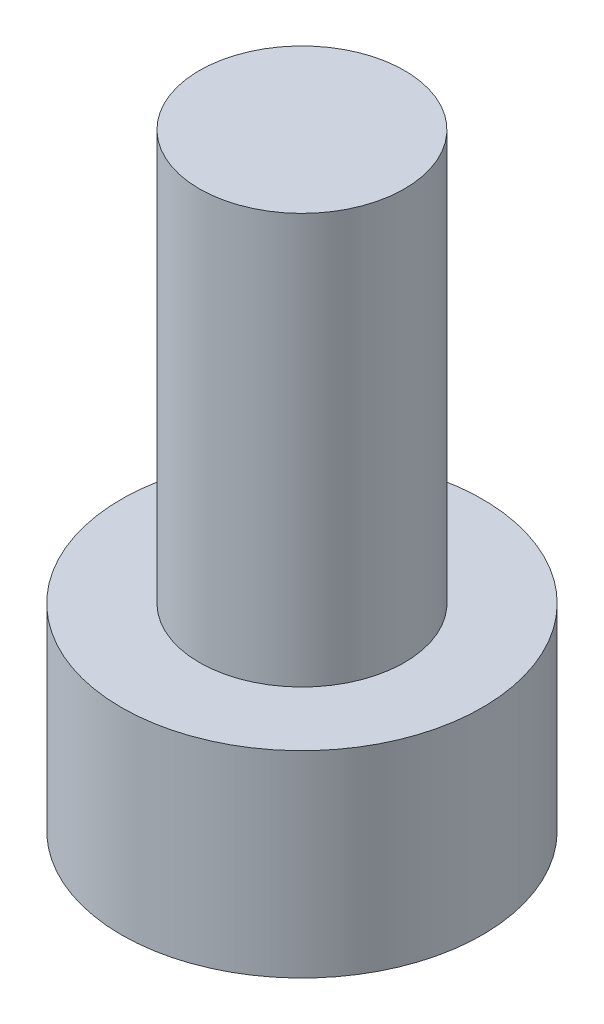
ISO-10303-21;
HEADER;
FILE_DESCRIPTION(('STEP AP214'),'2;1');
FILE_NAME('part.step','',(''),(''),'','','');
FILE_SCHEMA(('AUTOMOTIVE_DESIGN { 1 0 10303 214 1 1 1 1 }'));
ENDSEC;
DATA;
#1=APPLICATION_CONTEXT('core data for automotive mechanical design processes');
#2=APPLICATION_PROTOCOL_DEFINITION('international standard','automotive_design',2000,#1);
#3=PRODUCT_CONTEXT('',#1,'mechanical');
#4=PRODUCT('Part','Part','',(#3));
#5=PRODUCT_RELATED_PRODUCT_CATEGORY('part','',(#4));
#6=PRODUCT_DEFINITION_FORMATION('','',#4);
#7=PRODUCT_DEFINITION_CONTEXT('part definition',#1,'design');
#8=PRODUCT_DEFINITION('design','',#6,#7);
#9=PRODUCT_DEFINITION_SHAPE('','',#8);
#10=(LENGTH_UNIT() NAMED_UNIT(*) SI_UNIT(.MILLI.,.METRE.));
#11=(NAMED_UNIT(*) PLANE_ANGLE_UNIT() SI_UNIT($,.RADIAN.));
#12=(NAMED_UNIT(*) SI_UNIT($,.STERADIAN.) SOLID_ANGLE_UNIT());
#13=UNCERTAINTY_MEASURE_WITH_UNIT(LENGTH_MEASURE(1.E-05),#10,'distance_accuracy_value','');
#14=(GEOMETRIC_REPRESENTATION_CONTEXT(3) GLOBAL_UNCERTAINTY_ASSIGNED_CONTEXT((#13)) GLOBAL_UNIT_ASSIGNED_CONTEXT((#10,
#11,#12)) REPRESENTATION_CONTEXT('',''));
#15=CARTESIAN_POINT('',(0.,0.,0.));
#16=DIRECTION('',(0.,0.,1.));
#17=DIRECTION('',(1.,0.,0.));
#18=AXIS2_PLACEMENT_3D('',#15,#16,#17);
#19=CARTESIAN_POINT('',(0.,2.4,0.));
#20=DIRECTION('',(0.,-1.,0.));
#21=DIRECTION('',(0.,0.,-1.));
#22=AXIS2_PLACEMENT_3D('',#19,#20,#21);
#23=CYLINDRICAL_SURFACE('',#22,2.2);
#24=CARTESIAN_POINT('',(0.,2.4,0.));
#25=DIRECTION('',(0.,1.,0.));
#26=DIRECTION('',(0.,0.,1.));
#27=AXIS2_PLACEMENT_3D('',#24,#25,#26);
#28=CIRCLE('',#27,2.2);
#29=CARTESIAN_POINT('',(0.,2.4,2.2));
#30=VERTEX_POINT('',#29);
#31=EDGE_CURVE('E46',#30,#30,#28,.T.);
#32=ORIENTED_EDGE('',*,*,#31,.F.);
#33=EDGE_LOOP('',(#32));
#34=FACE_BOUND('',#33,.T.);
#35=CARTESIAN_POINT('',(0.,0.,0.));
#36=DIRECTION('',(0.,1.,0.));
#37=DIRECTION('',(0.,0.,1.));
#38=AXIS2_PLACEMENT_3D('',#35,#36,#37);
#39=CIRCLE('',#38,2.2);
#40=CARTESIAN_POINT('',(0.,0.,2.2));
#41=VERTEX_POINT('',#40);
#42=EDGE_CURVE('E41',#41,#41,#39,.T.);
#43=ORIENTED_EDGE('',*,*,#42,.T.);
#44=EDGE_LOOP('',(#43));
#45=FACE_BOUND('',#44,.T.);
#46=ADVANCED_FACE('F38',(#34,#45),#23,.T.);
#47=CARTESIAN_POINT('',(0.,2.4,0.));
#48=DIRECTION('',(0.,1.,0.));
#49=DIRECTION('',(0.,0.,1.));
#50=AXIS2_PLACEMENT_3D('',#47,#48,#49);
#51=PLANE('',#50);
#52=CARTESIAN_POINT('',(0.,2.4,0.));
#53=DIRECTION('',(0.,1.,0.));
#54=DIRECTION('',(0.,0.,1.));
#55=AXIS2_PLACEMENT_3D('',#52,#53,#54);
#56=CIRCLE('',#55,1.25);
#57=CARTESIAN_POINT('',(0.,2.4,1.25));
#58=VERTEX_POINT('',#57);
#59=EDGE_CURVE('E11',#58,#58,#56,.T.);
#60=ORIENTED_EDGE('',*,*,#59,.F.);
#61=EDGE_LOOP('',(#60));
#62=FACE_BOUND('',#61,.T.);
#63=ORIENTED_EDGE('',*,*,#31,.T.);
#64=EDGE_LOOP('',(#63));
#65=FACE_BOUND('',#64,.T.);
#66=ADVANCED_FACE('F158',(#62,#65),#51,.T.);
#67=CARTESIAN_POINT('',(0.,0.,0.));
#68=DIRECTION('',(0.,1.,0.));
#69=DIRECTION('',(0.,0.,1.));
#70=AXIS2_PLACEMENT_3D('',#67,#68,#69);
#71=PLANE('',#70);
#72=DIRECTION('',(-0.999999581919241,0.,-0.000914418581484688));
#73=VECTOR('',#72,1.);
#74=CARTESIAN_POINT('',(0.576435609229103,0.,1.00052752173341));
#75=LINE('',#74,#73);
#76=CARTESIAN_POINT('',(0.576435609229103,0.,1.00052752173341));
#77=VERTEX_POINT('',#76);
#78=CARTESIAN_POINT('',(-0.578264446392072,0.,0.999471642105069));
#79=VERTEX_POINT('',#78);
#80=EDGE_CURVE('E128',#77,#79,#75,.T.);
#81=ORIENTED_EDGE('',*,*,#80,.F.);
#82=DIRECTION('',(-0.500791700680879,0.,0.865567832425139));
#83=VECTOR('',#82,1.);
#84=CARTESIAN_POINT('',(1.15470005562118,0.,0.00105587962834426));
#85=LINE('',#84,#83);
#86=CARTESIAN_POINT('',(1.15470005562118,0.,0.00105587962834426));
#87=VERTEX_POINT('',#86);
#88=EDGE_CURVE('E54',#87,#77,#85,.T.);
#89=ORIENTED_EDGE('',*,*,#88,.F.);
#90=DIRECTION('',(0.499207881238363,0.,0.866482251006623));
#91=VECTOR('',#90,1.);
#92=CARTESIAN_POINT('',(0.578264446392072,0.,-0.99947164210507));
#93=LINE('',#92,#91);
#94=CARTESIAN_POINT('',(0.578264446392072,0.,-0.99947164210507));
#95=VERTEX_POINT('',#94);
#96=EDGE_CURVE('E137',#95,#87,#93,.T.);
#97=ORIENTED_EDGE('',*,*,#96,.F.);
#98=DIRECTION('',(0.999999581919241,0.,0.000914418581484501));
#99=VECTOR('',#98,1.);
#100=CARTESIAN_POINT('',(-0.576435609229103,0.,-1.00052752173341));
#101=LINE('',#100,#99);
#102=CARTESIAN_POINT('',(-0.576435609229103,0.,-1.00052752173341));
#103=VERTEX_POINT('',#102);
#104=EDGE_CURVE('E135',#103,#95,#101,.T.);
#105=ORIENTED_EDGE('',*,*,#104,.F.);
#106=DIRECTION('',(0.500791700680879,0.,-0.865567832425139));
#107=VECTOR('',#106,1.);
#108=CARTESIAN_POINT('',(-1.15470005562117,0.,-0.00105587962834411));
#109=LINE('',#108,#107);
#110=CARTESIAN_POINT('',(-1.15470005562117,0.,-0.00105587962834411));
#111=VERTEX_POINT('',#110);
#112=EDGE_CURVE('E102',#111,#103,#109,.T.);
#113=ORIENTED_EDGE('',*,*,#112,.F.);
#114=DIRECTION('',(-0.499207881238363,0.,-0.866482251006623));
#115=VECTOR('',#114,1.);
#116=CARTESIAN_POINT('',(-0.578264446392072,0.,0.999471642105069));
#117=LINE('',#116,#115);
#118=EDGE_CURVE('E131',#79,#111,#117,.T.);
#119=ORIENTED_EDGE('',*,*,#118,.F.);
#120=EDGE_LOOP('',(#81,#89,#97,#105,#113,#119));
#121=FACE_BOUND('',#120,.T.);
#122=ORIENTED_EDGE('',*,*,#42,.F.);
#123=EDGE_LOOP('',(#122));
#124=FACE_BOUND('',#123,.T.);
#125=ADVANCED_FACE('F155',(#121,#124),#71,.F.);
#126=CARTESIAN_POINT('',(0.,7.4,0.));
#127=DIRECTION('',(0.,-1.,0.));
#128=DIRECTION('',(0.,0.,-1.));
#129=AXIS2_PLACEMENT_3D('',#126,#127,#128);
#130=CYLINDRICAL_SURFACE('',#129,1.25);
#131=CARTESIAN_POINT('',(0.,7.4,0.));
#132=DIRECTION('',(0.,1.,0.));
#133=DIRECTION('',(0.,0.,1.));
#134=AXIS2_PLACEMENT_3D('',#131,#132,#133);
#135=CIRCLE('',#134,1.25);
#136=CARTESIAN_POINT('',(0.,7.4,1.25));
#137=VERTEX_POINT('',#136);
#138=EDGE_CURVE('E141',#137,#137,#135,.T.);
#139=ORIENTED_EDGE('',*,*,#138,.F.);
#140=EDGE_LOOP('',(#139));
#141=FACE_BOUND('',#140,.T.);
#142=ORIENTED_EDGE('',*,*,#59,.T.);
#143=EDGE_LOOP('',(#142));
#144=FACE_BOUND('',#143,.T.);
#145=ADVANCED_FACE('F157',(#141,#144),#130,.T.);
#146=CARTESIAN_POINT('',(0.,7.4,0.));
#147=DIRECTION('',(0.,1.,0.));
#148=DIRECTION('',(0.,0.,1.));
#149=AXIS2_PLACEMENT_3D('',#146,#147,#148);
#150=PLANE('',#149);
#151=ORIENTED_EDGE('',*,*,#138,.T.);
#152=EDGE_LOOP('',(#151));
#153=FACE_BOUND('',#152,.T.);
#154=ADVANCED_FACE('F164',(#153),#150,.T.);
#155=CARTESIAN_POINT('',(1.15470005562118,1.,0.00105587962834426));
#156=DIRECTION('',(0.865567832425139,0.,0.500791700680879));
#157=DIRECTION('',(0.500791700680879,0.,-0.865567832425139));
#158=AXIS2_PLACEMENT_3D('',#155,#156,#157);
#159=PLANE('',#158);
#160=ORIENTED_EDGE('',*,*,#88,.T.);
#161=DIRECTION('',(0.,-1.,0.));
#162=VECTOR('',#161,1.);
#163=CARTESIAN_POINT('',(0.576435609229103,1.,1.00052752173341));
#164=LINE('',#163,#162);
#165=CARTESIAN_POINT('',(0.576435609229103,1.,1.00052752173341));
#166=VERTEX_POINT('',#165);
#167=EDGE_CURVE('E84',#166,#77,#164,.T.);
#168=ORIENTED_EDGE('',*,*,#167,.F.);
#169=DIRECTION('',(-0.500791700680879,0.,0.865567832425139));
#170=VECTOR('',#169,1.);
#171=CARTESIAN_POINT('',(1.15470005562118,1.,0.00105587962834426));
#172=LINE('',#171,#170);
#173=CARTESIAN_POINT('',(1.15470005562118,1.,0.00105587962834426));
#174=VERTEX_POINT('',#173);
#175=EDGE_CURVE('E139',#174,#166,#172,.T.);
#176=ORIENTED_EDGE('',*,*,#175,.F.);
#177=DIRECTION('',(0.,-1.,0.));
#178=VECTOR('',#177,1.);
#179=CARTESIAN_POINT('',(1.15470005562118,1.,0.00105587962834426));
#180=LINE('',#179,#178);
#181=EDGE_CURVE('E62',#174,#87,#180,.T.);
#182=ORIENTED_EDGE('',*,*,#181,.T.);
#183=EDGE_LOOP('',(#160,#168,#176,#182));
#184=FACE_BOUND('',#183,.T.);
#185=ADVANCED_FACE('F195',(#184),#159,.F.);
#186=CARTESIAN_POINT('',(0.578264446392072,1.,-0.99947164210507));
#187=DIRECTION('',(0.866482251006623,0.,-0.499207881238363));
#188=DIRECTION('',(-0.499207881238363,0.,-0.866482251006623));
#189=AXIS2_PLACEMENT_3D('',#186,#187,#188);
#190=PLANE('',#189);
#191=ORIENTED_EDGE('',*,*,#96,.T.);
#192=ORIENTED_EDGE('',*,*,#181,.F.);
#193=DIRECTION('',(0.499207881238363,0.,0.866482251006623));
#194=VECTOR('',#193,1.);
#195=CARTESIAN_POINT('',(0.578264446392072,1.,-0.99947164210507));
#196=LINE('',#195,#194);
#197=CARTESIAN_POINT('',(0.578264446392072,1.,-0.99947164210507));
#198=VERTEX_POINT('',#197);
#199=EDGE_CURVE('E114',#198,#174,#196,.T.);
#200=ORIENTED_EDGE('',*,*,#199,.F.);
#201=DIRECTION('',(0.,-1.,0.));
#202=VECTOR('',#201,1.);
#203=CARTESIAN_POINT('',(0.578264446392072,1.,-0.99947164210507));
#204=LINE('',#203,#202);
#205=EDGE_CURVE('E106',#198,#95,#204,.T.);
#206=ORIENTED_EDGE('',*,*,#205,.T.);
#207=EDGE_LOOP('',(#191,#192,#200,#206));
#208=FACE_BOUND('',#207,.T.);
#209=ADVANCED_FACE('F211',(#208),#190,.F.);
#210=CARTESIAN_POINT('',(-0.576435609229103,1.,-1.00052752173341));
#211=DIRECTION('',(0.000914418581484501,0.,-0.999999581919241));
#212=DIRECTION('',(-0.999999581919242,0.,-0.000914418581484501));
#213=AXIS2_PLACEMENT_3D('',#210,#211,#212);
#214=PLANE('',#213);
#215=ORIENTED_EDGE('',*,*,#104,.T.);
#216=ORIENTED_EDGE('',*,*,#205,.F.);
#217=DIRECTION('',(0.999999581919241,0.,0.000914418581484501));
#218=VECTOR('',#217,1.);
#219=CARTESIAN_POINT('',(-0.576435609229103,1.,-1.00052752173341));
#220=LINE('',#219,#218);
#221=CARTESIAN_POINT('',(-0.576435609229103,1.,-1.00052752173341));
#222=VERTEX_POINT('',#221);
#223=EDGE_CURVE('E110',#222,#198,#220,.T.);
#224=ORIENTED_EDGE('',*,*,#223,.F.);
#225=DIRECTION('',(0.,-1.,0.));
#226=VECTOR('',#225,1.);
#227=CARTESIAN_POINT('',(-0.576435609229103,1.,-1.00052752173341));
#228=LINE('',#227,#226);
#229=EDGE_CURVE('E95',#222,#103,#228,.T.);
#230=ORIENTED_EDGE('',*,*,#229,.T.);
#231=EDGE_LOOP('',(#215,#216,#224,#230));
#232=FACE_BOUND('',#231,.T.);
#233=ADVANCED_FACE('F111',(#232),#214,.F.);
#234=CARTESIAN_POINT('',(-1.15470005562117,1.,-0.00105587962834411));
#235=DIRECTION('',(-0.865567832425139,0.,-0.500791700680879));
#236=DIRECTION('',(-0.500791700680879,0.,0.865567832425139));
#237=AXIS2_PLACEMENT_3D('',#234,#235,#236);
#238=PLANE('',#237);
#239=ORIENTED_EDGE('',*,*,#112,.T.);
#240=ORIENTED_EDGE('',*,*,#229,.F.);
#241=DIRECTION('',(0.500791700680879,0.,-0.865567832425139));
#242=VECTOR('',#241,1.);
#243=CARTESIAN_POINT('',(-1.15470005562117,1.,-0.00105587962834411));
#244=LINE('',#243,#242);
#245=CARTESIAN_POINT('',(-1.15470005562117,1.,-0.00105587962834411));
#246=VERTEX_POINT('',#245);
#247=EDGE_CURVE('E99',#246,#222,#244,.T.);
#248=ORIENTED_EDGE('',*,*,#247,.F.);
#249=DIRECTION('',(0.,-1.,0.));
#250=VECTOR('',#249,1.);
#251=CARTESIAN_POINT('',(-1.15470005562117,1.,-0.00105587962834411));
#252=LINE('',#251,#250);
#253=EDGE_CURVE('E107',#246,#111,#252,.T.);
#254=ORIENTED_EDGE('',*,*,#253,.T.);
#255=EDGE_LOOP('',(#239,#240,#248,#254));
#256=FACE_BOUND('',#255,.T.);
#257=ADVANCED_FACE('F97',(#256),#238,.F.);
#258=CARTESIAN_POINT('',(-0.578264446392072,1.,0.999471642105069));
#259=DIRECTION('',(-0.866482251006623,0.,0.499207881238363));
#260=DIRECTION('',(0.499207881238363,0.,0.866482251006623));
#261=AXIS2_PLACEMENT_3D('',#258,#259,#260);
#262=PLANE('',#261);
#263=ORIENTED_EDGE('',*,*,#118,.T.);
#264=ORIENTED_EDGE('',*,*,#253,.F.);
#265=DIRECTION('',(-0.499207881238363,0.,-0.866482251006623));
#266=VECTOR('',#265,1.);
#267=CARTESIAN_POINT('',(-0.578264446392072,1.,0.999471642105069));
#268=LINE('',#267,#266);
#269=CARTESIAN_POINT('',(-0.578264446392072,1.,0.999471642105069));
#270=VERTEX_POINT('',#269);
#271=EDGE_CURVE('E120',#270,#246,#268,.T.);
#272=ORIENTED_EDGE('',*,*,#271,.F.);
#273=DIRECTION('',(0.,-1.,0.));
#274=VECTOR('',#273,1.);
#275=CARTESIAN_POINT('',(-0.578264446392072,1.,0.999471642105069));
#276=LINE('',#275,#274);
#277=EDGE_CURVE('E144',#270,#79,#276,.T.);
#278=ORIENTED_EDGE('',*,*,#277,.T.);
#279=EDGE_LOOP('',(#263,#264,#272,#278));
#280=FACE_BOUND('',#279,.T.);
#281=ADVANCED_FACE('F239',(#280),#262,.F.);
#282=CARTESIAN_POINT('',(0.576435609229103,1.,1.00052752173341));
#283=DIRECTION('',(-0.000914418581484688,0.,0.999999581919241));
#284=DIRECTION('',(0.999999581919242,0.,0.000914418581484689));
#285=AXIS2_PLACEMENT_3D('',#282,#283,#284);
#286=PLANE('',#285);
#287=ORIENTED_EDGE('',*,*,#80,.T.);
#288=ORIENTED_EDGE('',*,*,#277,.F.);
#289=DIRECTION('',(-0.999999581919241,0.,-0.000914418581484688));
#290=VECTOR('',#289,1.);
#291=CARTESIAN_POINT('',(0.576435609229103,1.,1.00052752173341));
#292=LINE('',#291,#290);
#293=EDGE_CURVE('E122',#166,#270,#292,.T.);
#294=ORIENTED_EDGE('',*,*,#293,.F.);
#295=ORIENTED_EDGE('',*,*,#167,.T.);
#296=EDGE_LOOP('',(#287,#288,#294,#295));
#297=FACE_BOUND('',#296,.T.);
#298=ADVANCED_FACE('F249',(#297),#286,.F.);
#299=CARTESIAN_POINT('',(0.,1.,0.));
#300=DIRECTION('',(0.,-1.,0.));
#301=DIRECTION('',(0.,0.,-1.));
#302=AXIS2_PLACEMENT_3D('',#299,#300,#301);
#303=PLANE('',#302);
#304=ORIENTED_EDGE('',*,*,#175,.T.);
#305=ORIENTED_EDGE('',*,*,#293,.T.);
#306=ORIENTED_EDGE('',*,*,#271,.T.);
#307=ORIENTED_EDGE('',*,*,#247,.T.);
#308=ORIENTED_EDGE('',*,*,#223,.T.);
#309=ORIENTED_EDGE('',*,*,#199,.T.);
#310=EDGE_LOOP('',(#304,#305,#306,#307,#308,#309));
#311=FACE_BOUND('',#310,.T.);
#312=ADVANCED_FACE('F117',(#311),#303,.T.);
#313=CLOSED_SHELL('',(#46,#66,#125,#145,#154,#185,#209,#233,#257,#281,#298,#312));
#314=MANIFOLD_SOLID_BREP('B2',#313);
#315=ADVANCED_BREP_SHAPE_REPRESENTATION('',(#18,#314),#14);
#316=SHAPE_DEFINITION_REPRESENTATION(#9,#315);
ENDSEC;
END-ISO-10303-21;
